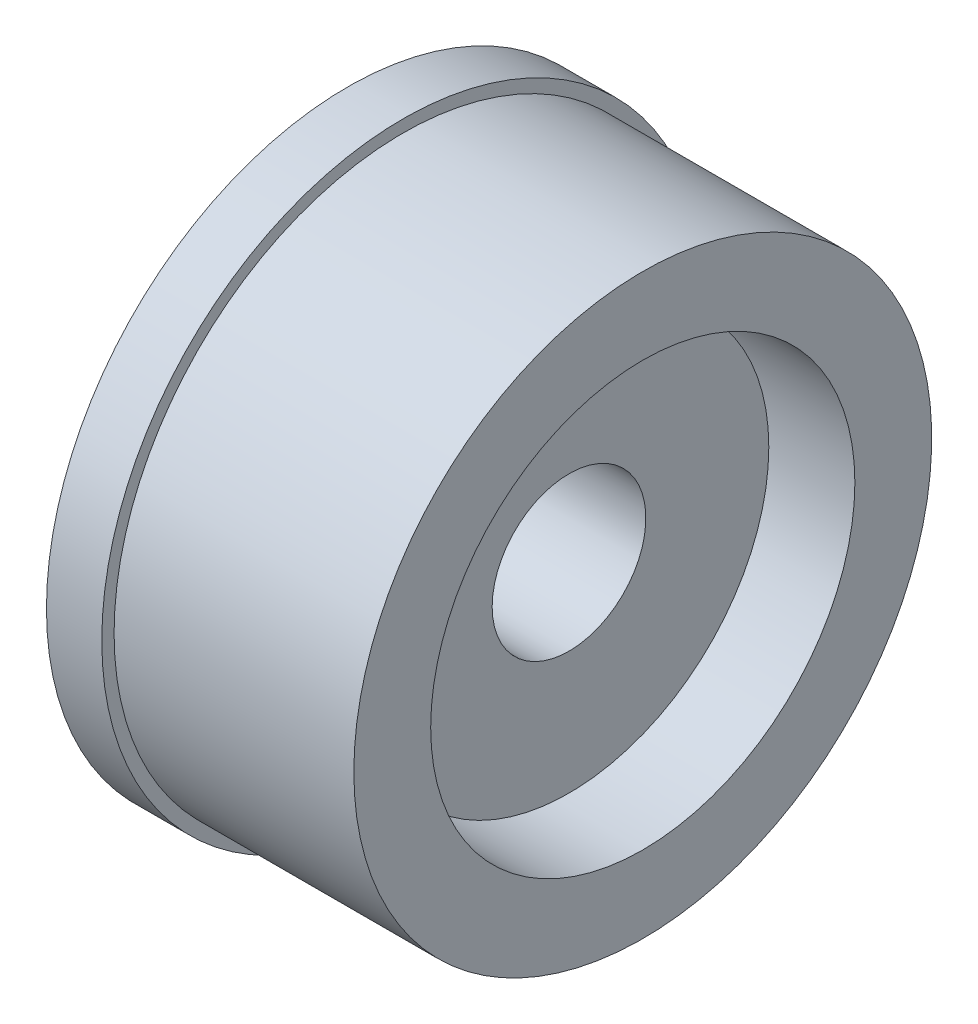
ISO-10303-21;
HEADER;
FILE_DESCRIPTION(('STEP AP214'),'2;1');
FILE_NAME('part.step','',(''),(''),'','','');
FILE_SCHEMA(('AUTOMOTIVE_DESIGN { 1 0 10303 214 1 1 1 1 }'));
ENDSEC;
DATA;
#1=APPLICATION_CONTEXT('core data for automotive mechanical design processes');
#2=APPLICATION_PROTOCOL_DEFINITION('international standard','automotive_design',2000,#1);
#3=PRODUCT_CONTEXT('',#1,'mechanical');
#4=PRODUCT('Part','Part','',(#3));
#5=PRODUCT_RELATED_PRODUCT_CATEGORY('part','',(#4));
#6=PRODUCT_DEFINITION_FORMATION('','',#4);
#7=PRODUCT_DEFINITION_CONTEXT('part definition',#1,'design');
#8=PRODUCT_DEFINITION('design','',#6,#7);
#9=PRODUCT_DEFINITION_SHAPE('','',#8);
#10=(LENGTH_UNIT() NAMED_UNIT(*) SI_UNIT(.MILLI.,.METRE.));
#11=(NAMED_UNIT(*) PLANE_ANGLE_UNIT() SI_UNIT($,.RADIAN.));
#12=(NAMED_UNIT(*) SI_UNIT($,.STERADIAN.) SOLID_ANGLE_UNIT());
#13=UNCERTAINTY_MEASURE_WITH_UNIT(LENGTH_MEASURE(1.E-05),#10,'distance_accuracy_value','');
#14=(GEOMETRIC_REPRESENTATION_CONTEXT(3) GLOBAL_UNCERTAINTY_ASSIGNED_CONTEXT((#13)) GLOBAL_UNIT_ASSIGNED_CONTEXT((#10,
#11,#12)) REPRESENTATION_CONTEXT('',''));
#15=CARTESIAN_POINT('',(0.,0.,0.));
#16=DIRECTION('',(0.,0.,1.));
#17=DIRECTION('',(1.,0.,0.));
#18=AXIS2_PLACEMENT_3D('',#15,#16,#17);
#19=CARTESIAN_POINT('',(3.,17.25,0.));
#20=DIRECTION('',(1.,0.,0.));
#21=DIRECTION('',(0.,0.,-1.));
#22=AXIS2_PLACEMENT_3D('',#19,#20,#21);
#23=PLANE('',#22);
#24=CARTESIAN_POINT('',(3.,0.,0.));
#25=DIRECTION('',(-1.,0.,0.));
#26=DIRECTION('',(0.,0.,1.));
#27=AXIS2_PLACEMENT_3D('',#24,#25,#26);
#28=CIRCLE('',#27,17.25);
#29=CARTESIAN_POINT('',(3.,0.,17.25));
#30=VERTEX_POINT('',#29);
#31=EDGE_CURVE('E62',#30,#30,#28,.T.);
#32=ORIENTED_EDGE('',*,*,#31,.F.);
#33=EDGE_LOOP('',(#32));
#34=FACE_BOUND('',#33,.T.);
#35=CARTESIAN_POINT('',(3.,0.,0.));
#36=DIRECTION('',(-1.,0.,0.));
#37=DIRECTION('',(0.,0.,1.));
#38=AXIS2_PLACEMENT_3D('',#35,#36,#37);
#39=CIRCLE('',#38,24.5);
#40=CARTESIAN_POINT('',(3.,0.,24.5));
#41=VERTEX_POINT('',#40);
#42=EDGE_CURVE('E11',#41,#41,#39,.T.);
#43=ORIENTED_EDGE('',*,*,#42,.T.);
#44=EDGE_LOOP('',(#43));
#45=FACE_BOUND('',#44,.T.);
#46=ADVANCED_FACE('F40',(#34,#45),#23,.F.);
#47=CARTESIAN_POINT('',(0.,0.,0.));
#48=DIRECTION('',(-1.,0.,0.));
#49=DIRECTION('',(0.,0.,1.));
#50=AXIS2_PLACEMENT_3D('',#47,#48,#49);
#51=CYLINDRICAL_SURFACE('',#50,24.5);
#52=ORIENTED_EDGE('',*,*,#42,.F.);
#53=EDGE_LOOP('',(#52));
#54=FACE_BOUND('',#53,.T.);
#55=CARTESIAN_POINT('',(7.5,0.,0.));
#56=DIRECTION('',(-1.,0.,0.));
#57=DIRECTION('',(0.,0.,1.));
#58=AXIS2_PLACEMENT_3D('',#55,#56,#57);
#59=CIRCLE('',#58,24.5);
#60=CARTESIAN_POINT('',(7.5,0.,24.5));
#61=VERTEX_POINT('',#60);
#62=EDGE_CURVE('E46',#61,#61,#59,.T.);
#63=ORIENTED_EDGE('',*,*,#62,.T.);
#64=EDGE_LOOP('',(#63));
#65=FACE_BOUND('',#64,.T.);
#66=ADVANCED_FACE('F69',(#54,#65),#51,.T.);
#67=CARTESIAN_POINT('',(7.5,24.5,0.));
#68=DIRECTION('',(-1.,0.,0.));
#69=DIRECTION('',(0.,0.,1.));
#70=AXIS2_PLACEMENT_3D('',#67,#68,#69);
#71=PLANE('',#70);
#72=ORIENTED_EDGE('',*,*,#62,.F.);
#73=EDGE_LOOP('',(#72));
#74=FACE_BOUND('',#73,.T.);
#75=CARTESIAN_POINT('',(7.5,0.,0.));
#76=DIRECTION('',(-1.,0.,0.));
#77=DIRECTION('',(0.,0.,1.));
#78=AXIS2_PLACEMENT_3D('',#75,#76,#77);
#79=CIRCLE('',#78,23.5);
#80=CARTESIAN_POINT('',(7.5,0.,23.5));
#81=VERTEX_POINT('',#80);
#82=EDGE_CURVE('E50',#81,#81,#79,.T.);
#83=ORIENTED_EDGE('',*,*,#82,.T.);
#84=EDGE_LOOP('',(#83));
#85=FACE_BOUND('',#84,.T.);
#86=ADVANCED_FACE('F73',(#74,#85),#71,.F.);
#87=CARTESIAN_POINT('',(0.,0.,0.));
#88=DIRECTION('',(-1.,0.,0.));
#89=DIRECTION('',(0.,0.,1.));
#90=AXIS2_PLACEMENT_3D('',#87,#88,#89);
#91=CYLINDRICAL_SURFACE('',#90,23.5);
#92=ORIENTED_EDGE('',*,*,#82,.F.);
#93=EDGE_LOOP('',(#92));
#94=FACE_BOUND('',#93,.T.);
#95=CARTESIAN_POINT('',(27.,0.,0.));
#96=DIRECTION('',(-1.,0.,0.));
#97=DIRECTION('',(0.,0.,1.));
#98=AXIS2_PLACEMENT_3D('',#95,#96,#97);
#99=CIRCLE('',#98,23.5);
#100=CARTESIAN_POINT('',(27.,0.,23.5));
#101=VERTEX_POINT('',#100);
#102=EDGE_CURVE('E54',#101,#101,#99,.T.);
#103=ORIENTED_EDGE('',*,*,#102,.T.);
#104=EDGE_LOOP('',(#103));
#105=FACE_BOUND('',#104,.T.);
#106=ADVANCED_FACE('F78',(#94,#105),#91,.T.);
#107=CARTESIAN_POINT('',(27.,17.25,0.));
#108=DIRECTION('',(-1.,0.,0.));
#109=DIRECTION('',(0.,0.,1.));
#110=AXIS2_PLACEMENT_3D('',#107,#108,#109);
#111=PLANE('',#110);
#112=ORIENTED_EDGE('',*,*,#102,.F.);
#113=EDGE_LOOP('',(#112));
#114=FACE_BOUND('',#113,.T.);
#115=CARTESIAN_POINT('',(27.,0.,0.));
#116=DIRECTION('',(-1.,0.,0.));
#117=DIRECTION('',(0.,0.,1.));
#118=AXIS2_PLACEMENT_3D('',#115,#116,#117);
#119=CIRCLE('',#118,17.25);
#120=CARTESIAN_POINT('',(27.,0.,17.25));
#121=VERTEX_POINT('',#120);
#122=EDGE_CURVE('E59',#121,#121,#119,.T.);
#123=ORIENTED_EDGE('',*,*,#122,.T.);
#124=EDGE_LOOP('',(#123));
#125=FACE_BOUND('',#124,.T.);
#126=ADVANCED_FACE('F84',(#114,#125),#111,.F.);
#127=CARTESIAN_POINT('',(0.,0.,0.));
#128=DIRECTION('',(-1.,0.,0.));
#129=DIRECTION('',(0.,0.,1.));
#130=AXIS2_PLACEMENT_3D('',#127,#128,#129);
#131=CYLINDRICAL_SURFACE('',#130,17.25);
#132=ORIENTED_EDGE('',*,*,#122,.F.);
#133=EDGE_LOOP('',(#132));
#134=FACE_BOUND('',#133,.T.);
#135=ORIENTED_EDGE('',*,*,#31,.T.);
#136=EDGE_LOOP('',(#135));
#137=FACE_BOUND('',#136,.T.);
#138=ADVANCED_FACE('F66',(#134,#137),#131,.F.);
#139=CLOSED_SHELL('',(#46,#66,#86,#106,#126,#138));
#140=MANIFOLD_SOLID_BREP('B2',#139);
#141=CARTESIAN_POINT('',(3.,0.,0.));
#142=DIRECTION('',(1.,0.,0.));
#143=DIRECTION('',(0.,0.,-1.));
#144=AXIS2_PLACEMENT_3D('',#141,#142,#143);
#145=CONICAL_SURFACE('',#144,16.25,1.10714871779409);
#146=CARTESIAN_POINT('',(0.,0.,0.));
#147=DIRECTION('',(-1.,0.,0.));
#148=DIRECTION('',(0.,0.,1.));
#149=AXIS2_PLACEMENT_3D('',#146,#147,#148);
#150=CIRCLE('',#149,10.25);
#151=CARTESIAN_POINT('',(0.,0.,10.25));
#152=VERTEX_POINT('',#151);
#153=EDGE_CURVE('E150',#152,#152,#150,.T.);
#154=ORIENTED_EDGE('',*,*,#153,.F.);
#155=EDGE_LOOP('',(#154));
#156=FACE_BOUND('',#155,.T.);
#157=CARTESIAN_POINT('',(3.,0.,0.));
#158=DIRECTION('',(-1.,0.,0.));
#159=DIRECTION('',(0.,0.,1.));
#160=AXIS2_PLACEMENT_3D('',#157,#158,#159);
#161=CIRCLE('',#160,16.25);
#162=CARTESIAN_POINT('',(3.,0.,16.25));
#163=VERTEX_POINT('',#162);
#164=EDGE_CURVE('E39',#163,#163,#161,.T.);
#165=ORIENTED_EDGE('',*,*,#164,.T.);
#166=EDGE_LOOP('',(#165));
#167=FACE_BOUND('',#166,.T.);
#168=ADVANCED_FACE('F131',(#156,#167),#145,.T.);
#169=CARTESIAN_POINT('',(0.,0.,0.));
#170=DIRECTION('',(-1.,0.,0.));
#171=DIRECTION('',(0.,0.,1.));
#172=AXIS2_PLACEMENT_3D('',#169,#170,#171);
#173=CYLINDRICAL_SURFACE('',#172,16.25);
#174=ORIENTED_EDGE('',*,*,#164,.F.);
#175=EDGE_LOOP('',(#174));
#176=FACE_BOUND('',#175,.T.);
#177=CARTESIAN_POINT('',(21.,0.,0.));
#178=DIRECTION('',(-1.,0.,0.));
#179=DIRECTION('',(0.,0.,1.));
#180=AXIS2_PLACEMENT_3D('',#177,#178,#179);
#181=CIRCLE('',#180,16.25);
#182=CARTESIAN_POINT('',(21.,0.,16.25));
#183=VERTEX_POINT('',#182);
#184=EDGE_CURVE('E137',#183,#183,#181,.T.);
#185=ORIENTED_EDGE('',*,*,#184,.T.);
#186=EDGE_LOOP('',(#185));
#187=FACE_BOUND('',#186,.T.);
#188=ADVANCED_FACE('F157',(#176,#187),#173,.T.);
#189=CARTESIAN_POINT('',(21.,6.25,0.));
#190=DIRECTION('',(-1.,0.,0.));
#191=DIRECTION('',(0.,0.,1.));
#192=AXIS2_PLACEMENT_3D('',#189,#190,#191);
#193=PLANE('',#192);
#194=ORIENTED_EDGE('',*,*,#184,.F.);
#195=EDGE_LOOP('',(#194));
#196=FACE_BOUND('',#195,.T.);
#197=CARTESIAN_POINT('',(21.,0.,0.));
#198=DIRECTION('',(-1.,0.,0.));
#199=DIRECTION('',(0.,0.,1.));
#200=AXIS2_PLACEMENT_3D('',#197,#198,#199);
#201=CIRCLE('',#200,6.25);
#202=CARTESIAN_POINT('',(21.,0.,6.25));
#203=VERTEX_POINT('',#202);
#204=EDGE_CURVE('E141',#203,#203,#201,.T.);
#205=ORIENTED_EDGE('',*,*,#204,.T.);
#206=EDGE_LOOP('',(#205));
#207=FACE_BOUND('',#206,.T.);
#208=ADVANCED_FACE('F161',(#196,#207),#193,.F.);
#209=CARTESIAN_POINT('',(0.,0.,0.));
#210=DIRECTION('',(-1.,0.,0.));
#211=DIRECTION('',(0.,0.,1.));
#212=AXIS2_PLACEMENT_3D('',#209,#210,#211);
#213=CYLINDRICAL_SURFACE('',#212,6.25);
#214=ORIENTED_EDGE('',*,*,#204,.F.);
#215=EDGE_LOOP('',(#214));
#216=FACE_BOUND('',#215,.T.);
#217=CARTESIAN_POINT('',(0.,0.,0.));
#218=DIRECTION('',(-1.,0.,0.));
#219=DIRECTION('',(0.,0.,1.));
#220=AXIS2_PLACEMENT_3D('',#217,#218,#219);
#221=CIRCLE('',#220,6.25);
#222=CARTESIAN_POINT('',(0.,0.,6.25));
#223=VERTEX_POINT('',#222);
#224=EDGE_CURVE('E145',#223,#223,#221,.T.);
#225=ORIENTED_EDGE('',*,*,#224,.T.);
#226=EDGE_LOOP('',(#225));
#227=FACE_BOUND('',#226,.T.);
#228=ADVANCED_FACE('F166',(#216,#227),#213,.F.);
#229=CARTESIAN_POINT('',(0.,6.25,0.));
#230=DIRECTION('',(1.,0.,0.));
#231=DIRECTION('',(0.,0.,-1.));
#232=AXIS2_PLACEMENT_3D('',#229,#230,#231);
#233=PLANE('',#232);
#234=ORIENTED_EDGE('',*,*,#224,.F.);
#235=EDGE_LOOP('',(#234));
#236=FACE_BOUND('',#235,.T.);
#237=ORIENTED_EDGE('',*,*,#153,.T.);
#238=EDGE_LOOP('',(#237));
#239=FACE_BOUND('',#238,.T.);
#240=ADVANCED_FACE('F154',(#236,#239),#233,.F.);
#241=CLOSED_SHELL('',(#168,#188,#208,#228,#240));
#242=MANIFOLD_SOLID_BREP('B6',#241);
#243=ADVANCED_BREP_SHAPE_REPRESENTATION('',(#18,#140,#242),#14);
#244=SHAPE_DEFINITION_REPRESENTATION(#9,#243);
ENDSEC;
END-ISO-10303-21;
